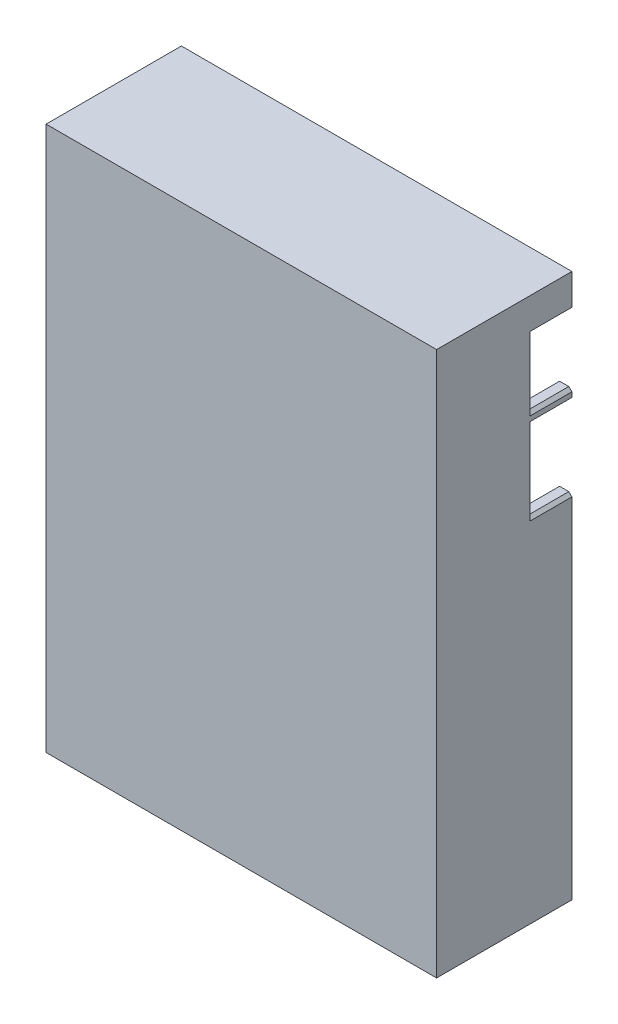
ISO-10303-21;
HEADER;
FILE_DESCRIPTION(('STEP AP214'),'2;1');
FILE_NAME('part.step','',(''),(''),'','','');
FILE_SCHEMA(('AUTOMOTIVE_DESIGN { 1 0 10303 214 1 1 1 1 }'));
ENDSEC;
DATA;
#1=APPLICATION_CONTEXT('core data for automotive mechanical design processes');
#2=APPLICATION_PROTOCOL_DEFINITION('international standard','automotive_design',2000,#1);
#3=PRODUCT_CONTEXT('',#1,'mechanical');
#4=PRODUCT('Part','Part','',(#3));
#5=PRODUCT_RELATED_PRODUCT_CATEGORY('part','',(#4));
#6=PRODUCT_DEFINITION_FORMATION('','',#4);
#7=PRODUCT_DEFINITION_CONTEXT('part definition',#1,'design');
#8=PRODUCT_DEFINITION('design','',#6,#7);
#9=PRODUCT_DEFINITION_SHAPE('','',#8);
#10=(LENGTH_UNIT() NAMED_UNIT(*) SI_UNIT(.MILLI.,.METRE.));
#11=(NAMED_UNIT(*) PLANE_ANGLE_UNIT() SI_UNIT($,.RADIAN.));
#12=(NAMED_UNIT(*) SI_UNIT($,.STERADIAN.) SOLID_ANGLE_UNIT());
#13=UNCERTAINTY_MEASURE_WITH_UNIT(LENGTH_MEASURE(1.E-05),#10,'distance_accuracy_value','');
#14=(GEOMETRIC_REPRESENTATION_CONTEXT(3) GLOBAL_UNCERTAINTY_ASSIGNED_CONTEXT((#13)) GLOBAL_UNIT_ASSIGNED_CONTEXT((#10,
#11,#12)) REPRESENTATION_CONTEXT('',''));
#15=CARTESIAN_POINT('',(0.,0.,0.));
#16=DIRECTION('',(0.,0.,1.));
#17=DIRECTION('',(1.,0.,0.));
#18=AXIS2_PLACEMENT_3D('',#15,#16,#17);
#19=CARTESIAN_POINT('',(0.,0.,-18.));
#20=DIRECTION('',(0.,0.,-1.));
#21=DIRECTION('',(-1.,0.,0.));
#22=AXIS2_PLACEMENT_3D('',#19,#20,#21);
#23=PLANE('',#22);
#24=DIRECTION('',(0.,1.,0.));
#25=VECTOR('',#24,1.);
#26=CARTESIAN_POINT('',(-39.821244,-28.203214,-18.));
#27=LINE('',#26,#25);
#28=CARTESIAN_POINT('',(-39.821244,-28.203214,-18.));
#29=VERTEX_POINT('',#28);
#30=CARTESIAN_POINT('',(-39.821244,3.20697733488394,-18.));
#31=VERTEX_POINT('',#30);
#32=EDGE_CURVE('E322',#29,#31,#27,.T.);
#33=ORIENTED_EDGE('',*,*,#32,.T.);
#34=DIRECTION('',(-1.,0.,0.));
#35=VECTOR('',#34,1.);
#36=CARTESIAN_POINT('',(-37.821244,3.20697733488395,-18.));
#37=LINE('',#36,#35);
#38=CARTESIAN_POINT('',(-37.821244,3.20697733488395,-18.));
#39=VERTEX_POINT('',#38);
#40=EDGE_CURVE('E400',#31,#39,#37,.F.);
#41=ORIENTED_EDGE('',*,*,#40,.T.);
#42=DIRECTION('',(0.,1.,0.));
#43=VECTOR('',#42,1.);
#44=CARTESIAN_POINT('',(-37.821244,-26.203214,-18.));
#45=LINE('',#44,#43);
#46=CARTESIAN_POINT('',(-37.821244,-26.203214,-18.));
#47=VERTEX_POINT('',#46);
#48=EDGE_CURVE('E289',#47,#39,#45,.T.);
#49=ORIENTED_EDGE('',*,*,#48,.F.);
#50=DIRECTION('',(-1.,0.,0.));
#51=VECTOR('',#50,1.);
#52=CARTESIAN_POINT('',(21.678756,-26.203214,-18.));
#53=LINE('',#52,#51);
#54=CARTESIAN_POINT('',(21.678756,-26.203214,-18.));
#55=VERTEX_POINT('',#54);
#56=EDGE_CURVE('E285',#55,#47,#53,.T.);
#57=ORIENTED_EDGE('',*,*,#56,.F.);
#58=DIRECTION('',(0.,-1.,0.));
#59=VECTOR('',#58,1.);
#60=CARTESIAN_POINT('',(21.678756,58.296786,-18.));
#61=LINE('',#60,#59);
#62=CARTESIAN_POINT('',(21.678756,29.046786,-18.));
#63=VERTEX_POINT('',#62);
#64=EDGE_CURVE('E294',#63,#55,#61,.T.);
#65=ORIENTED_EDGE('',*,*,#64,.F.);
#66=DIRECTION('',(1.,0.,0.));
#67=VECTOR('',#66,1.);
#68=CARTESIAN_POINT('',(7.21077410894139,29.046786,-18.));
#69=LINE('',#68,#67);
#70=CARTESIAN_POINT('',(23.178756,29.046786,-18.));
#71=VERTEX_POINT('',#70);
#72=EDGE_CURVE('E270',#63,#71,#69,.T.);
#73=ORIENTED_EDGE('',*,*,#72,.T.);
#74=DIRECTION('',(-0.707106781186552,0.707106781186543,0.));
#75=VECTOR('',#74,1.);
#76=CARTESIAN_POINT('',(26.1127709999998,26.1127710000002,-18.));
#77=LINE('',#76,#75);
#78=CARTESIAN_POINT('',(23.678756,28.546786,-18.));
#79=VERTEX_POINT('',#78);
#80=EDGE_CURVE('E367',#71,#79,#77,.F.);
#81=ORIENTED_EDGE('',*,*,#80,.T.);
#82=DIRECTION('',(0.,-1.,0.));
#83=VECTOR('',#82,1.);
#84=CARTESIAN_POINT('',(23.678756,60.296786,-18.));
#85=LINE('',#84,#83);
#86=CARTESIAN_POINT('',(23.678756,-28.203214,-18.));
#87=VERTEX_POINT('',#86);
#88=EDGE_CURVE('E328',#79,#87,#85,.T.);
#89=ORIENTED_EDGE('',*,*,#88,.T.);
#90=DIRECTION('',(-1.,0.,0.));
#91=VECTOR('',#90,1.);
#92=CARTESIAN_POINT('',(23.678756,-28.203214,-18.));
#93=LINE('',#92,#91);
#94=EDGE_CURVE('E318',#87,#29,#93,.T.);
#95=ORIENTED_EDGE('',*,*,#94,.T.);
#96=EDGE_LOOP('',(#33,#41,#49,#57,#65,#73,#81,#89,#95));
#97=FACE_BOUND('',#96,.T.);
#98=ADVANCED_FACE('F33',(#97),#23,.T.);
#99=CARTESIAN_POINT('',(-37.821244,40.2069773348839,-18.));
#100=VERTEX_POINT('',#99);
#101=CARTESIAN_POINT('',(-37.821244,58.296786,-18.));
#102=VERTEX_POINT('',#101);
#103=EDGE_CURVE('E287',#100,#102,#45,.T.);
#104=ORIENTED_EDGE('',*,*,#103,.F.);
#105=DIRECTION('',(-1.,0.,0.));
#106=VECTOR('',#105,1.);
#107=CARTESIAN_POINT('',(-39.821244,40.2069773348839,-18.));
#108=LINE('',#107,#106);
#109=CARTESIAN_POINT('',(-39.821244,40.2069773348839,-18.));
#110=VERTEX_POINT('',#109);
#111=EDGE_CURVE('E41',#100,#110,#108,.T.);
#112=ORIENTED_EDGE('',*,*,#111,.T.);
#113=CARTESIAN_POINT('',(-39.821244,60.296786,-18.));
#114=VERTEX_POINT('',#113);
#115=EDGE_CURVE('E321',#110,#114,#27,.T.);
#116=ORIENTED_EDGE('',*,*,#115,.T.);
#117=DIRECTION('',(1.,0.,0.));
#118=VECTOR('',#117,1.);
#119=CARTESIAN_POINT('',(-39.821244,60.296786,-18.));
#120=LINE('',#119,#118);
#121=CARTESIAN_POINT('',(23.678756,60.296786,-18.));
#122=VERTEX_POINT('',#121);
#123=EDGE_CURVE('E325',#114,#122,#120,.T.);
#124=ORIENTED_EDGE('',*,*,#123,.T.);
#125=CARTESIAN_POINT('',(23.678756,55.246786,-18.));
#126=VERTEX_POINT('',#125);
#127=EDGE_CURVE('E329',#122,#126,#85,.T.);
#128=ORIENTED_EDGE('',*,*,#127,.T.);
#129=DIRECTION('',(0.707106781186543,0.707106781186552,0.));
#130=VECTOR('',#129,1.);
#131=CARTESIAN_POINT('',(-15.7840149999998,15.7840149999996,-18.));
#132=LINE('',#131,#130);
#133=CARTESIAN_POINT('',(23.178756,54.746786,-18.));
#134=VERTEX_POINT('',#133);
#135=EDGE_CURVE('E369',#126,#134,#132,.F.);
#136=ORIENTED_EDGE('',*,*,#135,.T.);
#137=DIRECTION('',(1.,0.,0.));
#138=VECTOR('',#137,1.);
#139=CARTESIAN_POINT('',(7.21077410894138,54.746786,-18.));
#140=LINE('',#139,#138);
#141=CARTESIAN_POINT('',(21.678756,54.746786,-18.));
#142=VERTEX_POINT('',#141);
#143=EDGE_CURVE('E256',#142,#134,#140,.T.);
#144=ORIENTED_EDGE('',*,*,#143,.F.);
#145=CARTESIAN_POINT('',(21.678756,58.296786,-18.));
#146=VERTEX_POINT('',#145);
#147=EDGE_CURVE('E295',#146,#142,#61,.T.);
#148=ORIENTED_EDGE('',*,*,#147,.F.);
#149=DIRECTION('',(1.,0.,0.));
#150=VECTOR('',#149,1.);
#151=CARTESIAN_POINT('',(-37.821244,58.296786,-18.));
#152=LINE('',#151,#150);
#153=EDGE_CURVE('E291',#102,#146,#152,.T.);
#154=ORIENTED_EDGE('',*,*,#153,.F.);
#155=EDGE_LOOP('',(#104,#112,#116,#124,#128,#136,#144,#148,#154));
#156=FACE_BOUND('',#155,.T.);
#157=ADVANCED_FACE('F407',(#156),#23,.T.);
#158=CARTESIAN_POINT('',(-39.821244,60.296786,4.));
#159=DIRECTION('',(1.,0.,0.));
#160=DIRECTION('',(0.,1.,0.));
#161=AXIS2_PLACEMENT_3D('',#158,#159,#160);
#162=PLANE('',#161);
#163=CARTESIAN_POINT('',(-39.821244,40.654286,-12.4319913878431));
#164=DIRECTION('',(-1.,0.,0.));
#165=DIRECTION('',(0.,-1.,0.));
#166=AXIS2_PLACEMENT_3D('',#163,#164,#165);
#167=CIRCLE('',#166,0.75);
#168=CARTESIAN_POINT('',(-39.821244,39.904286,-12.4319913878431));
#169=VERTEX_POINT('',#168);
#170=EDGE_CURVE('E233',#169,#169,#167,.T.);
#171=ORIENTED_EDGE('',*,*,#170,.F.);
#172=EDGE_LOOP('',(#171));
#173=FACE_BOUND('',#172,.T.);
#174=DIRECTION('',(0.,0.,1.));
#175=VECTOR('',#174,1.);
#176=CARTESIAN_POINT('',(-39.821244,9.20697733488395,-18.));
#177=LINE('',#176,#175);
#178=CARTESIAN_POINT('',(-39.821244,9.20697733488394,-12.));
#179=VERTEX_POINT('',#178);
#180=CARTESIAN_POINT('',(-39.821244,9.20697733488394,-11.65));
#181=VERTEX_POINT('',#180);
#182=EDGE_CURVE('E229',#179,#181,#177,.T.);
#183=ORIENTED_EDGE('',*,*,#182,.F.);
#184=CARTESIAN_POINT('',(-39.821244,3.20697733488395,-12.));
#185=DIRECTION('',(1.,0.,0.));
#186=DIRECTION('',(0.,1.,0.));
#187=AXIS2_PLACEMENT_3D('',#184,#185,#186);
#188=CIRCLE('',#187,6.);
#189=EDGE_CURVE('E398',#179,#31,#188,.F.);
#190=ORIENTED_EDGE('',*,*,#189,.T.);
#191=ORIENTED_EDGE('',*,*,#32,.F.);
#192=DIRECTION('',(0.,0.,-1.));
#193=VECTOR('',#192,1.);
#194=CARTESIAN_POINT('',(-39.821244,-28.203214,4.));
#195=LINE('',#194,#193);
#196=CARTESIAN_POINT('',(-39.821244,-28.203214,4.));
#197=VERTEX_POINT('',#196);
#198=EDGE_CURVE('E350',#197,#29,#195,.T.);
#199=ORIENTED_EDGE('',*,*,#198,.F.);
#200=DIRECTION('',(0.,-1.,0.));
#201=VECTOR('',#200,1.);
#202=CARTESIAN_POINT('',(-39.821244,60.296786,4.));
#203=LINE('',#202,#201);
#204=CARTESIAN_POINT('',(-39.821244,60.296786,4.));
#205=VERTEX_POINT('',#204);
#206=EDGE_CURVE('E332',#205,#197,#203,.T.);
#207=ORIENTED_EDGE('',*,*,#206,.F.);
#208=DIRECTION('',(0.,0.,-1.));
#209=VECTOR('',#208,1.);
#210=CARTESIAN_POINT('',(-39.821244,60.296786,4.));
#211=LINE('',#210,#209);
#212=EDGE_CURVE('E342',#205,#114,#211,.T.);
#213=ORIENTED_EDGE('',*,*,#212,.T.);
#214=ORIENTED_EDGE('',*,*,#115,.F.);
#215=CARTESIAN_POINT('',(-39.821244,40.2069773348839,-12.));
#216=DIRECTION('',(1.,0.,0.));
#217=DIRECTION('',(0.,1.,0.));
#218=AXIS2_PLACEMENT_3D('',#215,#216,#217);
#219=CIRCLE('',#218,6.);
#220=CARTESIAN_POINT('',(-39.821244,34.2069773348839,-12.));
#221=VERTEX_POINT('',#220);
#222=EDGE_CURVE('E396',#110,#221,#219,.F.);
#223=ORIENTED_EDGE('',*,*,#222,.T.);
#224=DIRECTION('',(0.,0.,-1.));
#225=VECTOR('',#224,1.);
#226=CARTESIAN_POINT('',(-39.821244,34.2069773348839,-18.));
#227=LINE('',#226,#225);
#228=CARTESIAN_POINT('',(-39.821244,34.2069773348839,-11.65));
#229=VERTEX_POINT('',#228);
#230=EDGE_CURVE('E217',#229,#221,#227,.T.);
#231=ORIENTED_EDGE('',*,*,#230,.F.);
#232=DIRECTION('',(0.,1.,0.));
#233=VECTOR('',#232,1.);
#234=CARTESIAN_POINT('',(-39.821244,34.2069773348839,-11.65));
#235=LINE('',#234,#233);
#236=EDGE_CURVE('E467',#181,#229,#235,.T.);
#237=ORIENTED_EDGE('',*,*,#236,.F.);
#238=EDGE_LOOP('',(#183,#190,#191,#199,#207,#213,#214,#223,#231,#237));
#239=FACE_BOUND('',#238,.T.);
#240=ADVANCED_FACE('F411',(#173,#239),#162,.F.);
#241=CARTESIAN_POINT('',(-39.821244,-28.203214,4.));
#242=DIRECTION('',(0.,1.,0.));
#243=DIRECTION('',(0.,0.,1.));
#244=AXIS2_PLACEMENT_3D('',#241,#242,#243);
#245=PLANE('',#244);
#246=ORIENTED_EDGE('',*,*,#198,.T.);
#247=ORIENTED_EDGE('',*,*,#94,.F.);
#248=DIRECTION('',(0.,0.,-1.));
#249=VECTOR('',#248,1.);
#250=CARTESIAN_POINT('',(23.678756,-28.203214,4.));
#251=LINE('',#250,#249);
#252=CARTESIAN_POINT('',(23.678756,-28.203214,4.));
#253=VERTEX_POINT('',#252);
#254=EDGE_CURVE('E347',#253,#87,#251,.T.);
#255=ORIENTED_EDGE('',*,*,#254,.F.);
#256=DIRECTION('',(1.,0.,0.));
#257=VECTOR('',#256,1.);
#258=CARTESIAN_POINT('',(-39.821244,-28.203214,4.));
#259=LINE('',#258,#257);
#260=EDGE_CURVE('E336',#197,#253,#259,.T.);
#261=ORIENTED_EDGE('',*,*,#260,.F.);
#262=EDGE_LOOP('',(#246,#247,#255,#261));
#263=FACE_BOUND('',#262,.T.);
#264=ADVANCED_FACE('F510',(#263),#245,.F.);
#265=CARTESIAN_POINT('',(23.678756,60.296786,4.));
#266=DIRECTION('',(-1.,0.,0.));
#267=DIRECTION('',(0.,-1.,0.));
#268=AXIS2_PLACEMENT_3D('',#265,#266,#267);
#269=PLANE('',#268);
#270=DIRECTION('',(0.,1.,0.));
#271=VECTOR('',#270,1.);
#272=CARTESIAN_POINT('',(23.678756,60.296786,-11.15));
#273=LINE('',#272,#271);
#274=CARTESIAN_POINT('',(23.678756,43.346786,-11.15));
#275=VERTEX_POINT('',#274);
#276=CARTESIAN_POINT('',(23.678756,55.246786,-11.15));
#277=VERTEX_POINT('',#276);
#278=EDGE_CURVE('E363',#275,#277,#273,.T.);
#279=ORIENTED_EDGE('',*,*,#278,.T.);
#280=DIRECTION('',(0.,0.,-1.));
#281=VECTOR('',#280,1.);
#282=CARTESIAN_POINT('',(23.678756,55.246786,4.));
#283=LINE('',#282,#281);
#284=EDGE_CURVE('E365',#277,#126,#283,.T.);
#285=ORIENTED_EDGE('',*,*,#284,.T.);
#286=ORIENTED_EDGE('',*,*,#127,.F.);
#287=DIRECTION('',(0.,0.,-1.));
#288=VECTOR('',#287,1.);
#289=CARTESIAN_POINT('',(23.678756,60.296786,4.));
#290=LINE('',#289,#288);
#291=CARTESIAN_POINT('',(23.678756,60.296786,4.));
#292=VERTEX_POINT('',#291);
#293=EDGE_CURVE('E345',#292,#122,#290,.T.);
#294=ORIENTED_EDGE('',*,*,#293,.F.);
#295=DIRECTION('',(0.,1.,0.));
#296=VECTOR('',#295,1.);
#297=CARTESIAN_POINT('',(23.678756,60.296786,4.));
#298=LINE('',#297,#296);
#299=EDGE_CURVE('E338',#253,#292,#298,.T.);
#300=ORIENTED_EDGE('',*,*,#299,.F.);
#301=ORIENTED_EDGE('',*,*,#254,.T.);
#302=ORIENTED_EDGE('',*,*,#88,.F.);
#303=DIRECTION('',(0.,0.,1.));
#304=VECTOR('',#303,1.);
#305=CARTESIAN_POINT('',(23.678756,28.546786,4.));
#306=LINE('',#305,#304);
#307=CARTESIAN_POINT('',(23.678756,28.546786,-11.15));
#308=VERTEX_POINT('',#307);
#309=EDGE_CURVE('E355',#79,#308,#306,.T.);
#310=ORIENTED_EDGE('',*,*,#309,.T.);
#311=DIRECTION('',(0.,1.,0.));
#312=VECTOR('',#311,1.);
#313=CARTESIAN_POINT('',(23.678756,60.296786,-11.15));
#314=LINE('',#313,#312);
#315=CARTESIAN_POINT('',(23.678756,42.546786,-11.15));
#316=VERTEX_POINT('',#315);
#317=EDGE_CURVE('E357',#308,#316,#314,.T.);
#318=ORIENTED_EDGE('',*,*,#317,.T.);
#319=DIRECTION('',(0.,0.,-1.));
#320=VECTOR('',#319,1.);
#321=CARTESIAN_POINT('',(23.678756,42.546786,4.));
#322=LINE('',#321,#320);
#323=CARTESIAN_POINT('',(23.678756,42.546786,-18.));
#324=VERTEX_POINT('',#323);
#325=EDGE_CURVE('E359',#316,#324,#322,.T.);
#326=ORIENTED_EDGE('',*,*,#325,.T.);
#327=CARTESIAN_POINT('',(23.678756,43.346786,-18.));
#328=VERTEX_POINT('',#327);
#329=EDGE_CURVE('E333',#328,#324,#85,.T.);
#330=ORIENTED_EDGE('',*,*,#329,.F.);
#331=DIRECTION('',(0.,0.,1.));
#332=VECTOR('',#331,1.);
#333=CARTESIAN_POINT('',(23.678756,43.346786,4.));
#334=LINE('',#333,#332);
#335=EDGE_CURVE('E361',#328,#275,#334,.T.);
#336=ORIENTED_EDGE('',*,*,#335,.T.);
#337=EDGE_LOOP('',(#279,#285,#286,#294,#300,#301,#302,#310,#318,#326,#330,#336));
#338=FACE_BOUND('',#337,.T.);
#339=ADVANCED_FACE('F424',(#338),#269,.F.);
#340=CARTESIAN_POINT('',(-39.821244,60.296786,4.));
#341=DIRECTION('',(0.,-1.,0.));
#342=DIRECTION('',(0.,0.,-1.));
#343=AXIS2_PLACEMENT_3D('',#340,#341,#342);
#344=PLANE('',#343);
#345=ORIENTED_EDGE('',*,*,#293,.T.);
#346=ORIENTED_EDGE('',*,*,#123,.F.);
#347=ORIENTED_EDGE('',*,*,#212,.F.);
#348=DIRECTION('',(-1.,0.,0.));
#349=VECTOR('',#348,1.);
#350=CARTESIAN_POINT('',(-39.821244,60.296786,4.));
#351=LINE('',#350,#349);
#352=EDGE_CURVE('E340',#292,#205,#351,.T.);
#353=ORIENTED_EDGE('',*,*,#352,.F.);
#354=EDGE_LOOP('',(#345,#346,#347,#353));
#355=FACE_BOUND('',#354,.T.);
#356=ADVANCED_FACE('F419',(#355),#344,.F.);
#357=CARTESIAN_POINT('',(0.,0.,4.));
#358=DIRECTION('',(0.,0.,1.));
#359=DIRECTION('',(1.,0.,0.));
#360=AXIS2_PLACEMENT_3D('',#357,#358,#359);
#361=PLANE('',#360);
#362=ORIENTED_EDGE('',*,*,#206,.T.);
#363=ORIENTED_EDGE('',*,*,#260,.T.);
#364=ORIENTED_EDGE('',*,*,#299,.T.);
#365=ORIENTED_EDGE('',*,*,#352,.T.);
#366=EDGE_LOOP('',(#362,#363,#364,#365));
#367=FACE_BOUND('',#366,.T.);
#368=ADVANCED_FACE('F486',(#367),#361,.T.);
#369=DIRECTION('',(1.,0.,0.));
#370=VECTOR('',#369,1.);
#371=CARTESIAN_POINT('',(7.21077410894138,43.846786,-18.));
#372=LINE('',#371,#370);
#373=CARTESIAN_POINT('',(21.678756,43.846786,-18.));
#374=VERTEX_POINT('',#373);
#375=CARTESIAN_POINT('',(23.178756,43.846786,-18.));
#376=VERTEX_POINT('',#375);
#377=EDGE_CURVE('E249',#374,#376,#372,.T.);
#378=ORIENTED_EDGE('',*,*,#377,.T.);
#379=DIRECTION('',(-0.707106781186533,0.707106781186562,0.));
#380=VECTOR('',#379,1.);
#381=CARTESIAN_POINT('',(33.5127710000005,33.5127709999991,-18.));
#382=LINE('',#381,#380);
#383=EDGE_CURVE('E377',#376,#328,#382,.F.);
#384=ORIENTED_EDGE('',*,*,#383,.T.);
#385=ORIENTED_EDGE('',*,*,#329,.T.);
#386=DIRECTION('',(0.707106781186548,0.707106781186548,0.));
#387=VECTOR('',#386,1.);
#388=CARTESIAN_POINT('',(-9.434015,9.434015,-18.));
#389=LINE('',#388,#387);
#390=CARTESIAN_POINT('',(23.178756,42.046786,-18.));
#391=VERTEX_POINT('',#390);
#392=EDGE_CURVE('E375',#324,#391,#389,.F.);
#393=ORIENTED_EDGE('',*,*,#392,.T.);
#394=DIRECTION('',(1.,0.,0.));
#395=VECTOR('',#394,1.);
#396=CARTESIAN_POINT('',(7.21077410894138,42.046786,-18.));
#397=LINE('',#396,#395);
#398=CARTESIAN_POINT('',(21.678756,42.046786,-18.));
#399=VERTEX_POINT('',#398);
#400=EDGE_CURVE('E277',#399,#391,#397,.T.);
#401=ORIENTED_EDGE('',*,*,#400,.F.);
#402=EDGE_CURVE('E299',#374,#399,#61,.T.);
#403=ORIENTED_EDGE('',*,*,#402,.F.);
#404=EDGE_LOOP('',(#378,#384,#385,#393,#401,#403));
#405=FACE_BOUND('',#404,.T.);
#406=ADVANCED_FACE('F479',(#405),#23,.T.);
#407=CARTESIAN_POINT('',(21.678756,-26.203214,-18.));
#408=DIRECTION('',(0.,1.,0.));
#409=DIRECTION('',(0.,0.,1.));
#410=AXIS2_PLACEMENT_3D('',#407,#408,#409);
#411=PLANE('',#410);
#412=DIRECTION('',(-1.,0.,0.));
#413=VECTOR('',#412,1.);
#414=CARTESIAN_POINT('',(21.678756,-26.203214,2.));
#415=LINE('',#414,#413);
#416=CARTESIAN_POINT('',(21.678756,-26.203214,2.));
#417=VERTEX_POINT('',#416);
#418=CARTESIAN_POINT('',(-37.821244,-26.203214,2.));
#419=VERTEX_POINT('',#418);
#420=EDGE_CURVE('E284',#417,#419,#415,.T.);
#421=ORIENTED_EDGE('',*,*,#420,.F.);
#422=DIRECTION('',(0.,0.,1.));
#423=VECTOR('',#422,1.);
#424=CARTESIAN_POINT('',(21.678756,-26.203214,-18.));
#425=LINE('',#424,#423);
#426=EDGE_CURVE('E298',#55,#417,#425,.T.);
#427=ORIENTED_EDGE('',*,*,#426,.F.);
#428=ORIENTED_EDGE('',*,*,#56,.T.);
#429=DIRECTION('',(0.,0.,1.));
#430=VECTOR('',#429,1.);
#431=CARTESIAN_POINT('',(-37.821244,-26.203214,-18.));
#432=LINE('',#431,#430);
#433=EDGE_CURVE('E315',#47,#419,#432,.T.);
#434=ORIENTED_EDGE('',*,*,#433,.T.);
#435=EDGE_LOOP('',(#421,#427,#428,#434));
#436=FACE_BOUND('',#435,.T.);
#437=ADVANCED_FACE('F457',(#436),#411,.T.);
#438=CARTESIAN_POINT('',(-37.821244,-26.203214,-18.));
#439=DIRECTION('',(1.,0.,0.));
#440=DIRECTION('',(0.,1.,0.));
#441=AXIS2_PLACEMENT_3D('',#438,#439,#440);
#442=PLANE('',#441);
#443=ORIENTED_EDGE('',*,*,#48,.T.);
#444=CARTESIAN_POINT('',(-37.821244,3.20697733488395,-12.));
#445=DIRECTION('',(1.,0.,0.));
#446=DIRECTION('',(0.,1.,0.));
#447=AXIS2_PLACEMENT_3D('',#444,#445,#446);
#448=CIRCLE('',#447,6.);
#449=CARTESIAN_POINT('',(-37.821244,9.20697733488395,-12.));
#450=VERTEX_POINT('',#449);
#451=EDGE_CURVE('E211',#39,#450,#448,.T.);
#452=ORIENTED_EDGE('',*,*,#451,.T.);
#453=DIRECTION('',(0.,0.,1.));
#454=VECTOR('',#453,1.);
#455=CARTESIAN_POINT('',(-37.821244,9.20697733488395,-18.));
#456=LINE('',#455,#454);
#457=CARTESIAN_POINT('',(-37.821244,9.20697733488395,-11.65));
#458=VERTEX_POINT('',#457);
#459=EDGE_CURVE('E204',#450,#458,#456,.T.);
#460=ORIENTED_EDGE('',*,*,#459,.T.);
#461=DIRECTION('',(0.,1.,0.));
#462=VECTOR('',#461,1.);
#463=CARTESIAN_POINT('',(-37.821244,34.2069773348839,-11.65));
#464=LINE('',#463,#462);
#465=CARTESIAN_POINT('',(-37.821244,34.206977334884,-11.65));
#466=VERTEX_POINT('',#465);
#467=EDGE_CURVE('E209',#458,#466,#464,.T.);
#468=ORIENTED_EDGE('',*,*,#467,.T.);
#469=DIRECTION('',(0.,0.,-1.));
#470=VECTOR('',#469,1.);
#471=CARTESIAN_POINT('',(-37.821244,34.2069773348839,-18.));
#472=LINE('',#471,#470);
#473=CARTESIAN_POINT('',(-37.821244,34.2069773348839,-12.));
#474=VERTEX_POINT('',#473);
#475=EDGE_CURVE('E237',#466,#474,#472,.T.);
#476=ORIENTED_EDGE('',*,*,#475,.T.);
#477=CARTESIAN_POINT('',(-37.821244,40.2069773348839,-12.));
#478=DIRECTION('',(1.,0.,0.));
#479=DIRECTION('',(0.,1.,0.));
#480=AXIS2_PLACEMENT_3D('',#477,#478,#479);
#481=CIRCLE('',#480,6.);
#482=EDGE_CURVE('E48',#474,#100,#481,.T.);
#483=ORIENTED_EDGE('',*,*,#482,.T.);
#484=ORIENTED_EDGE('',*,*,#103,.T.);
#485=DIRECTION('',(0.,0.,1.));
#486=VECTOR('',#485,1.);
#487=CARTESIAN_POINT('',(-37.821244,58.296786,-18.));
#488=LINE('',#487,#486);
#489=CARTESIAN_POINT('',(-37.821244,58.296786,2.));
#490=VERTEX_POINT('',#489);
#491=EDGE_CURVE('E313',#102,#490,#488,.T.);
#492=ORIENTED_EDGE('',*,*,#491,.T.);
#493=DIRECTION('',(0.,1.,0.));
#494=VECTOR('',#493,1.);
#495=CARTESIAN_POINT('',(-37.821244,-26.203214,2.));
#496=LINE('',#495,#494);
#497=EDGE_CURVE('E302',#419,#490,#496,.T.);
#498=ORIENTED_EDGE('',*,*,#497,.F.);
#499=ORIENTED_EDGE('',*,*,#433,.F.);
#500=EDGE_LOOP('',(#443,#452,#460,#468,#476,#483,#484,#492,#498,#499));
#501=FACE_BOUND('',#500,.T.);
#502=CARTESIAN_POINT('',(-37.821244,40.654286,-12.4319913878431));
#503=DIRECTION('',(1.,0.,0.));
#504=DIRECTION('',(0.,1.,0.));
#505=AXIS2_PLACEMENT_3D('',#502,#503,#504);
#506=CIRCLE('',#505,0.75);
#507=CARTESIAN_POINT('',(-37.821244,41.404286,-12.4319913878431));
#508=VERTEX_POINT('',#507);
#509=EDGE_CURVE('E236',#508,#508,#506,.F.);
#510=ORIENTED_EDGE('',*,*,#509,.T.);
#511=EDGE_LOOP('',(#510));
#512=FACE_BOUND('',#511,.T.);
#513=ADVANCED_FACE('F207',(#501,#512),#442,.T.);
#514=CARTESIAN_POINT('',(-37.821244,58.296786,-18.));
#515=DIRECTION('',(0.,-1.,0.));
#516=DIRECTION('',(0.,0.,-1.));
#517=AXIS2_PLACEMENT_3D('',#514,#515,#516);
#518=PLANE('',#517);
#519=DIRECTION('',(1.,0.,0.));
#520=VECTOR('',#519,1.);
#521=CARTESIAN_POINT('',(-37.821244,58.296786,2.));
#522=LINE('',#521,#520);
#523=CARTESIAN_POINT('',(21.678756,58.296786,2.));
#524=VERTEX_POINT('',#523);
#525=EDGE_CURVE('E305',#490,#524,#522,.T.);
#526=ORIENTED_EDGE('',*,*,#525,.F.);
#527=ORIENTED_EDGE('',*,*,#491,.F.);
#528=ORIENTED_EDGE('',*,*,#153,.T.);
#529=DIRECTION('',(0.,0.,1.));
#530=VECTOR('',#529,1.);
#531=CARTESIAN_POINT('',(21.678756,58.296786,-18.));
#532=LINE('',#531,#530);
#533=EDGE_CURVE('E311',#146,#524,#532,.T.);
#534=ORIENTED_EDGE('',*,*,#533,.T.);
#535=EDGE_LOOP('',(#526,#527,#528,#534));
#536=FACE_BOUND('',#535,.T.);
#537=ADVANCED_FACE('F450',(#536),#518,.T.);
#538=CARTESIAN_POINT('',(21.678756,58.296786,-18.));
#539=DIRECTION('',(-1.,0.,0.));
#540=DIRECTION('',(0.,-1.,0.));
#541=AXIS2_PLACEMENT_3D('',#538,#539,#540);
#542=PLANE('',#541);
#543=DIRECTION('',(0.,0.,1.));
#544=VECTOR('',#543,1.);
#545=CARTESIAN_POINT('',(21.678756,54.746786,-18.));
#546=LINE('',#545,#544);
#547=CARTESIAN_POINT('',(21.678756,54.746786,-11.65));
#548=VERTEX_POINT('',#547);
#549=EDGE_CURVE('E241',#142,#548,#546,.T.);
#550=ORIENTED_EDGE('',*,*,#549,.T.);
#551=DIRECTION('',(0.,-1.,0.));
#552=VECTOR('',#551,1.);
#553=CARTESIAN_POINT('',(21.678756,43.846786,-11.65));
#554=LINE('',#553,#552);
#555=CARTESIAN_POINT('',(21.678756,43.846786,-11.65));
#556=VERTEX_POINT('',#555);
#557=EDGE_CURVE('E251',#548,#556,#554,.T.);
#558=ORIENTED_EDGE('',*,*,#557,.T.);
#559=DIRECTION('',(0.,0.,-1.));
#560=VECTOR('',#559,1.);
#561=CARTESIAN_POINT('',(21.678756,43.846786,-18.));
#562=LINE('',#561,#560);
#563=EDGE_CURVE('E246',#556,#374,#562,.T.);
#564=ORIENTED_EDGE('',*,*,#563,.T.);
#565=ORIENTED_EDGE('',*,*,#402,.T.);
#566=DIRECTION('',(0.,0.,1.));
#567=VECTOR('',#566,1.);
#568=CARTESIAN_POINT('',(21.678756,42.046786,-18.));
#569=LINE('',#568,#567);
#570=CARTESIAN_POINT('',(21.678756,42.046786,-11.65));
#571=VERTEX_POINT('',#570);
#572=EDGE_CURVE('E263',#399,#571,#569,.T.);
#573=ORIENTED_EDGE('',*,*,#572,.T.);
#574=DIRECTION('',(0.,-1.,0.));
#575=VECTOR('',#574,1.);
#576=CARTESIAN_POINT('',(21.678756,29.046786,-11.65));
#577=LINE('',#576,#575);
#578=CARTESIAN_POINT('',(21.678756,29.046786,-11.65));
#579=VERTEX_POINT('',#578);
#580=EDGE_CURVE('E272',#571,#579,#577,.T.);
#581=ORIENTED_EDGE('',*,*,#580,.T.);
#582=DIRECTION('',(0.,0.,-1.));
#583=VECTOR('',#582,1.);
#584=CARTESIAN_POINT('',(21.678756,29.046786,-18.));
#585=LINE('',#584,#583);
#586=EDGE_CURVE('E267',#579,#63,#585,.T.);
#587=ORIENTED_EDGE('',*,*,#586,.T.);
#588=ORIENTED_EDGE('',*,*,#64,.T.);
#589=ORIENTED_EDGE('',*,*,#426,.T.);
#590=DIRECTION('',(0.,-1.,0.));
#591=VECTOR('',#590,1.);
#592=CARTESIAN_POINT('',(21.678756,58.296786,2.));
#593=LINE('',#592,#591);
#594=EDGE_CURVE('E288',#524,#417,#593,.T.);
#595=ORIENTED_EDGE('',*,*,#594,.F.);
#596=ORIENTED_EDGE('',*,*,#533,.F.);
#597=ORIENTED_EDGE('',*,*,#147,.T.);
#598=EDGE_LOOP('',(#550,#558,#564,#565,#573,#581,#587,#588,#589,#595,#596,#597));
#599=FACE_BOUND('',#598,.T.);
#600=ADVANCED_FACE('F444',(#599),#542,.T.);
#601=CARTESIAN_POINT('',(0.,0.,2.));
#602=DIRECTION('',(0.,0.,1.));
#603=DIRECTION('',(1.,0.,0.));
#604=AXIS2_PLACEMENT_3D('',#601,#602,#603);
#605=PLANE('',#604);
#606=ORIENTED_EDGE('',*,*,#594,.T.);
#607=ORIENTED_EDGE('',*,*,#420,.T.);
#608=ORIENTED_EDGE('',*,*,#497,.T.);
#609=ORIENTED_EDGE('',*,*,#525,.T.);
#610=EDGE_LOOP('',(#606,#607,#608,#609));
#611=FACE_BOUND('',#610,.T.);
#612=ADVANCED_FACE('F460',(#611),#605,.F.);
#613=CARTESIAN_POINT('',(7.21077410894138,42.046786,-18.));
#614=DIRECTION('',(0.,1.,0.));
#615=DIRECTION('',(-1.,0.,0.));
#616=AXIS2_PLACEMENT_3D('',#613,#614,#615);
#617=PLANE('',#616);
#618=ORIENTED_EDGE('',*,*,#400,.T.);
#619=DIRECTION('',(0.,0.,1.));
#620=VECTOR('',#619,1.);
#621=CARTESIAN_POINT('',(23.178756,42.046786,-18.));
#622=LINE('',#621,#620);
#623=CARTESIAN_POINT('',(23.178756,42.046786,-11.65));
#624=VERTEX_POINT('',#623);
#625=EDGE_CURVE('E379',#391,#624,#622,.T.);
#626=ORIENTED_EDGE('',*,*,#625,.T.);
#627=DIRECTION('',(1.,0.,0.));
#628=VECTOR('',#627,1.);
#629=CARTESIAN_POINT('',(7.21077410894138,42.046786,-11.65));
#630=LINE('',#629,#628);
#631=EDGE_CURVE('E266',#571,#624,#630,.T.);
#632=ORIENTED_EDGE('',*,*,#631,.F.);
#633=ORIENTED_EDGE('',*,*,#572,.F.);
#634=EDGE_LOOP('',(#618,#626,#632,#633));
#635=FACE_BOUND('',#634,.T.);
#636=ADVANCED_FACE('F553',(#635),#617,.F.);
#637=CARTESIAN_POINT('',(7.21077410894139,29.046786,-11.65));
#638=DIRECTION('',(0.,0.,1.));
#639=DIRECTION('',(1.,0.,0.));
#640=AXIS2_PLACEMENT_3D('',#637,#638,#639);
#641=PLANE('',#640);
#642=ORIENTED_EDGE('',*,*,#631,.T.);
#643=DIRECTION('',(0.,-1.,0.));
#644=VECTOR('',#643,1.);
#645=CARTESIAN_POINT('',(23.178756,29.046786,-11.65));
#646=LINE('',#645,#644);
#647=CARTESIAN_POINT('',(23.178756,29.046786,-11.65));
#648=VERTEX_POINT('',#647);
#649=EDGE_CURVE('E382',#624,#648,#646,.T.);
#650=ORIENTED_EDGE('',*,*,#649,.T.);
#651=DIRECTION('',(1.,0.,0.));
#652=VECTOR('',#651,1.);
#653=CARTESIAN_POINT('',(7.21077410894139,29.046786,-11.65));
#654=LINE('',#653,#652);
#655=EDGE_CURVE('E271',#579,#648,#654,.T.);
#656=ORIENTED_EDGE('',*,*,#655,.F.);
#657=ORIENTED_EDGE('',*,*,#580,.F.);
#658=EDGE_LOOP('',(#642,#650,#656,#657));
#659=FACE_BOUND('',#658,.T.);
#660=ADVANCED_FACE('F555',(#659),#641,.F.);
#661=CARTESIAN_POINT('',(7.21077410894139,29.046786,-18.));
#662=DIRECTION('',(0.,-1.,0.));
#663=DIRECTION('',(1.,0.,0.));
#664=AXIS2_PLACEMENT_3D('',#661,#662,#663);
#665=PLANE('',#664);
#666=ORIENTED_EDGE('',*,*,#655,.T.);
#667=DIRECTION('',(0.,0.,-1.));
#668=VECTOR('',#667,1.);
#669=CARTESIAN_POINT('',(23.178756,29.046786,-18.));
#670=LINE('',#669,#668);
#671=EDGE_CURVE('E384',#648,#71,#670,.T.);
#672=ORIENTED_EDGE('',*,*,#671,.T.);
#673=ORIENTED_EDGE('',*,*,#72,.F.);
#674=ORIENTED_EDGE('',*,*,#586,.F.);
#675=EDGE_LOOP('',(#666,#672,#673,#674));
#676=FACE_BOUND('',#675,.T.);
#677=ADVANCED_FACE('F557',(#676),#665,.F.);
#678=CARTESIAN_POINT('',(7.21077410894138,54.746786,-18.));
#679=DIRECTION('',(0.,1.,0.));
#680=DIRECTION('',(-1.,0.,0.));
#681=AXIS2_PLACEMENT_3D('',#678,#679,#680);
#682=PLANE('',#681);
#683=ORIENTED_EDGE('',*,*,#143,.T.);
#684=DIRECTION('',(0.,0.,1.));
#685=VECTOR('',#684,1.);
#686=CARTESIAN_POINT('',(23.178756,54.746786,-18.));
#687=LINE('',#686,#685);
#688=CARTESIAN_POINT('',(23.178756,54.746786,-11.65));
#689=VERTEX_POINT('',#688);
#690=EDGE_CURVE('E352',#134,#689,#687,.T.);
#691=ORIENTED_EDGE('',*,*,#690,.T.);
#692=DIRECTION('',(1.,0.,0.));
#693=VECTOR('',#692,1.);
#694=CARTESIAN_POINT('',(7.21077410894138,54.746786,-11.65));
#695=LINE('',#694,#693);
#696=EDGE_CURVE('E244',#548,#689,#695,.T.);
#697=ORIENTED_EDGE('',*,*,#696,.F.);
#698=ORIENTED_EDGE('',*,*,#549,.F.);
#699=EDGE_LOOP('',(#683,#691,#697,#698));
#700=FACE_BOUND('',#699,.T.);
#701=ADVANCED_FACE('F440',(#700),#682,.F.);
#702=CARTESIAN_POINT('',(7.21077410894138,43.846786,-11.65));
#703=DIRECTION('',(0.,0.,1.));
#704=DIRECTION('',(1.,0.,0.));
#705=AXIS2_PLACEMENT_3D('',#702,#703,#704);
#706=PLANE('',#705);
#707=ORIENTED_EDGE('',*,*,#696,.T.);
#708=DIRECTION('',(0.,-1.,0.));
#709=VECTOR('',#708,1.);
#710=CARTESIAN_POINT('',(23.178756,43.846786,-11.65));
#711=LINE('',#710,#709);
#712=CARTESIAN_POINT('',(23.178756,43.846786,-11.65));
#713=VERTEX_POINT('',#712);
#714=EDGE_CURVE('E371',#689,#713,#711,.T.);
#715=ORIENTED_EDGE('',*,*,#714,.T.);
#716=DIRECTION('',(1.,0.,0.));
#717=VECTOR('',#716,1.);
#718=CARTESIAN_POINT('',(7.21077410894138,43.846786,-11.65));
#719=LINE('',#718,#717);
#720=EDGE_CURVE('E250',#556,#713,#719,.T.);
#721=ORIENTED_EDGE('',*,*,#720,.F.);
#722=ORIENTED_EDGE('',*,*,#557,.F.);
#723=EDGE_LOOP('',(#707,#715,#721,#722));
#724=FACE_BOUND('',#723,.T.);
#725=ADVANCED_FACE('F442',(#724),#706,.F.);
#726=CARTESIAN_POINT('',(7.21077410894138,43.846786,-18.));
#727=DIRECTION('',(0.,-1.,0.));
#728=DIRECTION('',(1.,0.,0.));
#729=AXIS2_PLACEMENT_3D('',#726,#727,#728);
#730=PLANE('',#729);
#731=ORIENTED_EDGE('',*,*,#720,.T.);
#732=DIRECTION('',(0.,0.,-1.));
#733=VECTOR('',#732,1.);
#734=CARTESIAN_POINT('',(23.178756,43.846786,-18.));
#735=LINE('',#734,#733);
#736=EDGE_CURVE('E373',#713,#376,#735,.T.);
#737=ORIENTED_EDGE('',*,*,#736,.T.);
#738=ORIENTED_EDGE('',*,*,#377,.F.);
#739=ORIENTED_EDGE('',*,*,#563,.F.);
#740=EDGE_LOOP('',(#731,#737,#738,#739));
#741=FACE_BOUND('',#740,.T.);
#742=ADVANCED_FACE('F529',(#741),#730,.F.);
#743=CARTESIAN_POINT('',(23.178756,43.846786,-18.));
#744=DIRECTION('',(-0.707106781186562,-0.707106781186533,0.));
#745=DIRECTION('',(0.,0.,-1.));
#746=AXIS2_PLACEMENT_3D('',#743,#744,#745);
#747=PLANE('',#746);
#748=ORIENTED_EDGE('',*,*,#383,.F.);
#749=ORIENTED_EDGE('',*,*,#736,.F.);
#750=DIRECTION('',(0.577350269189613,-0.577350269189637,0.577350269189628));
#751=VECTOR('',#750,1.);
#752=CARTESIAN_POINT('',(23.178756,43.846786,-11.65));
#753=LINE('',#752,#751);
#754=EDGE_CURVE('E245',#275,#713,#753,.F.);
#755=ORIENTED_EDGE('',*,*,#754,.F.);
#756=ORIENTED_EDGE('',*,*,#335,.F.);
#757=EDGE_LOOP('',(#748,#749,#755,#756));
#758=FACE_BOUND('',#757,.T.);
#759=ADVANCED_FACE('F501',(#758),#747,.F.);
#760=CARTESIAN_POINT('',(23.178756,43.846786,-11.65));
#761=DIRECTION('',(-0.707106781186557,0.,0.707106781186538));
#762=DIRECTION('',(0.,-1.,0.));
#763=AXIS2_PLACEMENT_3D('',#760,#761,#762);
#764=PLANE('',#763);
#765=ORIENTED_EDGE('',*,*,#754,.T.);
#766=ORIENTED_EDGE('',*,*,#714,.F.);
#767=DIRECTION('',(0.577350269189618,0.577350269189626,0.577350269189634));
#768=VECTOR('',#767,1.);
#769=CARTESIAN_POINT('',(21.0620893333333,52.6301193333333,-13.7666666666667));
#770=LINE('',#769,#768);
#771=EDGE_CURVE('E387',#277,#689,#770,.F.);
#772=ORIENTED_EDGE('',*,*,#771,.F.);
#773=ORIENTED_EDGE('',*,*,#278,.F.);
#774=EDGE_LOOP('',(#765,#766,#772,#773));
#775=FACE_BOUND('',#774,.T.);
#776=ADVANCED_FACE('F434',(#775),#764,.F.);
#777=CARTESIAN_POINT('',(23.178756,54.746786,-18.));
#778=DIRECTION('',(-0.707106781186552,0.707106781186542,0.));
#779=DIRECTION('',(0.,0.,1.));
#780=AXIS2_PLACEMENT_3D('',#777,#778,#779);
#781=PLANE('',#780);
#782=ORIENTED_EDGE('',*,*,#135,.F.);
#783=ORIENTED_EDGE('',*,*,#284,.F.);
#784=ORIENTED_EDGE('',*,*,#771,.T.);
#785=ORIENTED_EDGE('',*,*,#690,.F.);
#786=EDGE_LOOP('',(#782,#783,#784,#785));
#787=FACE_BOUND('',#786,.T.);
#788=ADVANCED_FACE('F430',(#787),#781,.F.);
#789=CARTESIAN_POINT('',(23.178756,29.046786,-18.));
#790=DIRECTION('',(-0.707106781186543,-0.707106781186552,0.));
#791=DIRECTION('',(0.,0.,-1.));
#792=AXIS2_PLACEMENT_3D('',#789,#790,#791);
#793=PLANE('',#792);
#794=ORIENTED_EDGE('',*,*,#80,.F.);
#795=ORIENTED_EDGE('',*,*,#671,.F.);
#796=DIRECTION('',(0.577350269189629,-0.577350269189621,0.577350269189628));
#797=VECTOR('',#796,1.);
#798=CARTESIAN_POINT('',(23.178756,29.046786,-11.65));
#799=LINE('',#798,#797);
#800=EDGE_CURVE('E389',#308,#648,#799,.F.);
#801=ORIENTED_EDGE('',*,*,#800,.F.);
#802=ORIENTED_EDGE('',*,*,#309,.F.);
#803=EDGE_LOOP('',(#794,#795,#801,#802));
#804=FACE_BOUND('',#803,.T.);
#805=ADVANCED_FACE('F524',(#804),#793,.F.);
#806=CARTESIAN_POINT('',(23.178756,29.046786,-11.65));
#807=DIRECTION('',(-0.707106781186547,0.,0.707106781186548));
#808=DIRECTION('',(0.,-1.,0.));
#809=AXIS2_PLACEMENT_3D('',#806,#807,#808);
#810=PLANE('',#809);
#811=ORIENTED_EDGE('',*,*,#800,.T.);
#812=ORIENTED_EDGE('',*,*,#649,.F.);
#813=DIRECTION('',(0.577350269189626,0.577350269189626,0.577350269189626));
#814=VECTOR('',#813,1.);
#815=CARTESIAN_POINT('',(21.0620893333333,39.9301193333333,-13.7666666666667));
#816=LINE('',#815,#814);
#817=EDGE_CURVE('E240',#316,#624,#816,.F.);
#818=ORIENTED_EDGE('',*,*,#817,.F.);
#819=ORIENTED_EDGE('',*,*,#317,.F.);
#820=EDGE_LOOP('',(#811,#812,#818,#819));
#821=FACE_BOUND('',#820,.T.);
#822=ADVANCED_FACE('F534',(#821),#810,.F.);
#823=CARTESIAN_POINT('',(23.178756,42.046786,-18.));
#824=DIRECTION('',(-0.707106781186548,0.707106781186548,0.));
#825=DIRECTION('',(0.,0.,1.));
#826=AXIS2_PLACEMENT_3D('',#823,#824,#825);
#827=PLANE('',#826);
#828=ORIENTED_EDGE('',*,*,#392,.F.);
#829=ORIENTED_EDGE('',*,*,#325,.F.);
#830=ORIENTED_EDGE('',*,*,#817,.T.);
#831=ORIENTED_EDGE('',*,*,#625,.F.);
#832=EDGE_LOOP('',(#828,#829,#830,#831));
#833=FACE_BOUND('',#832,.T.);
#834=ADVANCED_FACE('F530',(#833),#827,.F.);
#835=CARTESIAN_POINT('',(-12.0273978346837,40.654286,-12.4319913878431));
#836=DIRECTION('',(-1.,0.,0.));
#837=DIRECTION('',(0.,-1.,0.));
#838=AXIS2_PLACEMENT_3D('',#835,#836,#837);
#839=CYLINDRICAL_SURFACE('',#838,0.75);
#840=ORIENTED_EDGE('',*,*,#170,.T.);
#841=EDGE_LOOP('',(#840));
#842=FACE_BOUND('',#841,.T.);
#843=ORIENTED_EDGE('',*,*,#509,.F.);
#844=EDGE_LOOP('',(#843));
#845=FACE_BOUND('',#844,.T.);
#846=ADVANCED_FACE('F533',(#842,#845),#839,.F.);
#847=CARTESIAN_POINT('',(-12.0273978346837,9.20697733488395,-18.));
#848=DIRECTION('',(0.,-1.,0.));
#849=DIRECTION('',(0.,0.,-1.));
#850=AXIS2_PLACEMENT_3D('',#847,#848,#849);
#851=PLANE('',#850);
#852=ORIENTED_EDGE('',*,*,#459,.F.);
#853=DIRECTION('',(-1.,0.,0.));
#854=VECTOR('',#853,1.);
#855=CARTESIAN_POINT('',(-39.821244,9.20697733488395,-12.));
#856=LINE('',#855,#854);
#857=EDGE_CURVE('E386',#450,#179,#856,.T.);
#858=ORIENTED_EDGE('',*,*,#857,.T.);
#859=ORIENTED_EDGE('',*,*,#182,.T.);
#860=DIRECTION('',(-1.,0.,0.));
#861=VECTOR('',#860,1.);
#862=CARTESIAN_POINT('',(-12.0273978346837,9.20697733488395,-11.65));
#863=LINE('',#862,#861);
#864=EDGE_CURVE('E216',#458,#181,#863,.T.);
#865=ORIENTED_EDGE('',*,*,#864,.F.);
#866=EDGE_LOOP('',(#852,#858,#859,#865));
#867=FACE_BOUND('',#866,.T.);
#868=ADVANCED_FACE('F227',(#867),#851,.F.);
#869=CARTESIAN_POINT('',(-12.0273978346837,34.206977334884,-11.65));
#870=DIRECTION('',(0.,0.,1.));
#871=DIRECTION('',(0.,-1.,0.));
#872=AXIS2_PLACEMENT_3D('',#869,#870,#871);
#873=PLANE('',#872);
#874=ORIENTED_EDGE('',*,*,#864,.T.);
#875=ORIENTED_EDGE('',*,*,#236,.T.);
#876=DIRECTION('',(-1.,0.,0.));
#877=VECTOR('',#876,1.);
#878=CARTESIAN_POINT('',(-12.0273978346837,34.206977334884,-11.65));
#879=LINE('',#878,#877);
#880=EDGE_CURVE('E225',#466,#229,#879,.T.);
#881=ORIENTED_EDGE('',*,*,#880,.F.);
#882=ORIENTED_EDGE('',*,*,#467,.F.);
#883=EDGE_LOOP('',(#874,#875,#881,#882));
#884=FACE_BOUND('',#883,.T.);
#885=ADVANCED_FACE('F222',(#884),#873,.F.);
#886=CARTESIAN_POINT('',(-12.0273978346837,34.206977334884,-18.));
#887=DIRECTION('',(0.,1.,0.));
#888=DIRECTION('',(-1.,0.,0.));
#889=AXIS2_PLACEMENT_3D('',#886,#887,#888);
#890=PLANE('',#889);
#891=ORIENTED_EDGE('',*,*,#230,.T.);
#892=DIRECTION('',(-1.,0.,0.));
#893=VECTOR('',#892,1.);
#894=CARTESIAN_POINT('',(-37.821244,34.2069773348839,-12.));
#895=LINE('',#894,#893);
#896=EDGE_CURVE('E11',#221,#474,#895,.F.);
#897=ORIENTED_EDGE('',*,*,#896,.T.);
#898=ORIENTED_EDGE('',*,*,#475,.F.);
#899=ORIENTED_EDGE('',*,*,#880,.T.);
#900=EDGE_LOOP('',(#891,#897,#898,#899));
#901=FACE_BOUND('',#900,.T.);
#902=ADVANCED_FACE('F472',(#901),#890,.F.);
#903=CARTESIAN_POINT('',(-12.0273978346837,3.20697733488395,-12.));
#904=DIRECTION('',(1.,0.,0.));
#905=DIRECTION('',(0.,1.,0.));
#906=AXIS2_PLACEMENT_3D('',#903,#904,#905);
#907=CYLINDRICAL_SURFACE('',#906,6.);
#908=ORIENTED_EDGE('',*,*,#451,.F.);
#909=ORIENTED_EDGE('',*,*,#40,.F.);
#910=ORIENTED_EDGE('',*,*,#189,.F.);
#911=ORIENTED_EDGE('',*,*,#857,.F.);
#912=EDGE_LOOP('',(#908,#909,#910,#911));
#913=FACE_BOUND('',#912,.T.);
#914=ADVANCED_FACE('F465',(#913),#907,.T.);
#915=CARTESIAN_POINT('',(0.,40.206977334884,-12.));
#916=DIRECTION('',(1.,0.,0.));
#917=DIRECTION('',(0.,1.,0.));
#918=AXIS2_PLACEMENT_3D('',#915,#916,#917);
#919=CYLINDRICAL_SURFACE('',#918,6.);
#920=ORIENTED_EDGE('',*,*,#482,.F.);
#921=ORIENTED_EDGE('',*,*,#896,.F.);
#922=ORIENTED_EDGE('',*,*,#222,.F.);
#923=ORIENTED_EDGE('',*,*,#111,.F.);
#924=EDGE_LOOP('',(#920,#921,#922,#923));
#925=FACE_BOUND('',#924,.T.);
#926=ADVANCED_FACE('F35',(#925),#919,.T.);
#927=CLOSED_SHELL('',(#98,#157,#240,#264,#339,#356,#368,#406,#437,#513,#537,#600,#612,#636,#660,
#677,#701,#725,#742,#759,#776,#788,#805,#822,#834,#846,#868,#885,#902,#914,#926));
#928=MANIFOLD_SOLID_BREP('B2',#927);
#929=ADVANCED_BREP_SHAPE_REPRESENTATION('',(#18,#928),#14);
#930=SHAPE_DEFINITION_REPRESENTATION(#9,#929);
ENDSEC;
END-ISO-10303-21;
